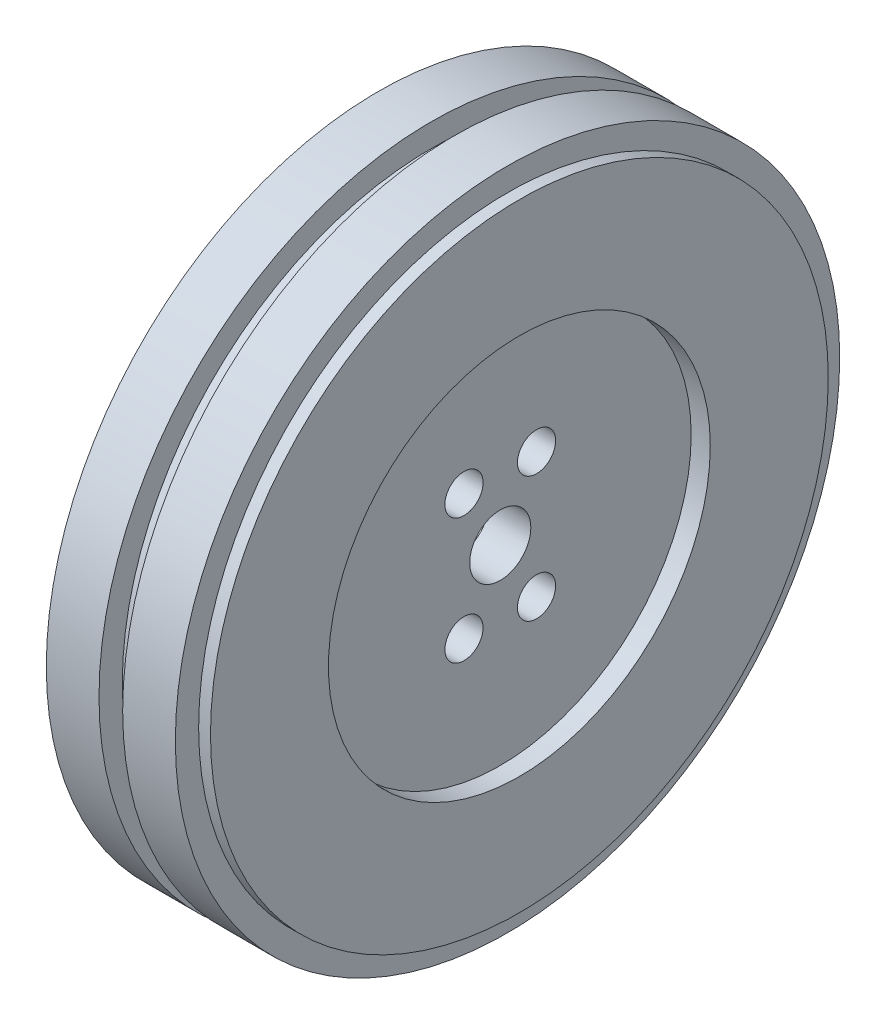
ISO-10303-21;
HEADER;
FILE_DESCRIPTION(('STEP AP214'),'2;1');
FILE_NAME('part.step','',(''),(''),'','','');
FILE_SCHEMA(('AUTOMOTIVE_DESIGN { 1 0 10303 214 1 1 1 1 }'));
ENDSEC;
DATA;
#1=APPLICATION_CONTEXT('core data for automotive mechanical design processes');
#2=APPLICATION_PROTOCOL_DEFINITION('international standard','automotive_design',2000,#1);
#3=PRODUCT_CONTEXT('',#1,'mechanical');
#4=PRODUCT('Part','Part','',(#3));
#5=PRODUCT_RELATED_PRODUCT_CATEGORY('part','',(#4));
#6=PRODUCT_DEFINITION_FORMATION('','',#4);
#7=PRODUCT_DEFINITION_CONTEXT('part definition',#1,'design');
#8=PRODUCT_DEFINITION('design','',#6,#7);
#9=PRODUCT_DEFINITION_SHAPE('','',#8);
#10=(LENGTH_UNIT() NAMED_UNIT(*) SI_UNIT(.MILLI.,.METRE.));
#11=(NAMED_UNIT(*) PLANE_ANGLE_UNIT() SI_UNIT($,.RADIAN.));
#12=(NAMED_UNIT(*) SI_UNIT($,.STERADIAN.) SOLID_ANGLE_UNIT());
#13=UNCERTAINTY_MEASURE_WITH_UNIT(LENGTH_MEASURE(1.E-05),#10,'distance_accuracy_value','');
#14=(GEOMETRIC_REPRESENTATION_CONTEXT(3) GLOBAL_UNCERTAINTY_ASSIGNED_CONTEXT((#13)) GLOBAL_UNIT_ASSIGNED_CONTEXT((#10,
#11,#12)) REPRESENTATION_CONTEXT('',''));
#15=CARTESIAN_POINT('',(0.,0.,0.));
#16=DIRECTION('',(0.,0.,1.));
#17=DIRECTION('',(1.,0.,0.));
#18=AXIS2_PLACEMENT_3D('',#15,#16,#17);
#19=CARTESIAN_POINT('',(8.00000000000001,0.,0.));
#20=DIRECTION('',(-1.,0.,0.));
#21=DIRECTION('',(0.,0.,1.));
#22=AXIS2_PLACEMENT_3D('',#19,#20,#21);
#23=CYLINDRICAL_SURFACE('',#22,43.5);
#24=CARTESIAN_POINT('',(-0.449999999999995,0.,0.));
#25=DIRECTION('',(-1.,0.,0.));
#26=DIRECTION('',(0.,0.,1.));
#27=AXIS2_PLACEMENT_3D('',#24,#25,#26);
#28=CIRCLE('',#27,43.5);
#29=CARTESIAN_POINT('',(-0.449999999999995,0.,43.5));
#30=VERTEX_POINT('',#29);
#31=EDGE_CURVE('E116',#30,#30,#28,.T.);
#32=ORIENTED_EDGE('',*,*,#31,.F.);
#33=EDGE_LOOP('',(#32));
#34=FACE_BOUND('',#33,.T.);
#35=CARTESIAN_POINT('',(6.45,0.,0.));
#36=DIRECTION('',(1.,0.,0.));
#37=DIRECTION('',(0.,0.,-1.));
#38=AXIS2_PLACEMENT_3D('',#35,#36,#37);
#39=CIRCLE('',#38,43.5);
#40=CARTESIAN_POINT('',(6.45,0.,-43.5));
#41=VERTEX_POINT('',#40);
#42=EDGE_CURVE('E105',#41,#41,#39,.T.);
#43=ORIENTED_EDGE('',*,*,#42,.F.);
#44=EDGE_LOOP('',(#43));
#45=FACE_BOUND('',#44,.T.);
#46=ADVANCED_FACE('F37',(#34,#45),#23,.T.);
#47=CARTESIAN_POINT('',(8.,40.,0.));
#48=DIRECTION('',(-1.,0.,0.));
#49=DIRECTION('',(0.,0.,1.));
#50=AXIS2_PLACEMENT_3D('',#47,#48,#49);
#51=PLANE('',#50);
#52=CARTESIAN_POINT('',(8.,0.,0.));
#53=DIRECTION('',(1.,0.,0.));
#54=DIRECTION('',(0.,0.,-1.));
#55=AXIS2_PLACEMENT_3D('',#52,#53,#54);
#56=CIRCLE('',#55,25.);
#57=CARTESIAN_POINT('',(8.,0.,-25.));
#58=VERTEX_POINT('',#57);
#59=EDGE_CURVE('E96',#58,#58,#56,.T.);
#60=ORIENTED_EDGE('',*,*,#59,.F.);
#61=EDGE_LOOP('',(#60));
#62=FACE_BOUND('',#61,.T.);
#63=CARTESIAN_POINT('',(8.,0.,0.));
#64=DIRECTION('',(1.,0.,0.));
#65=DIRECTION('',(0.,0.,-1.));
#66=AXIS2_PLACEMENT_3D('',#63,#64,#65);
#67=CIRCLE('',#66,40.45);
#68=CARTESIAN_POINT('',(8.,0.,-40.45));
#69=VERTEX_POINT('',#68);
#70=EDGE_CURVE('E99',#69,#69,#67,.T.);
#71=ORIENTED_EDGE('',*,*,#70,.T.);
#72=EDGE_LOOP('',(#71));
#73=FACE_BOUND('',#72,.T.);
#74=ADVANCED_FACE('F82',(#62,#73),#51,.F.);
#75=CARTESIAN_POINT('',(-12.,0.,0.));
#76=DIRECTION('',(-1.,0.,0.));
#77=DIRECTION('',(0.,0.,1.));
#78=AXIS2_PLACEMENT_3D('',#75,#76,#77);
#79=PLANE('',#78);
#80=CARTESIAN_POINT('',(-12.,0.,34.));
#81=CARTESIAN_POINT('',(-12.,4.45058959136558,34.));
#82=CARTESIAN_POINT('',(-12.0000000000056,8.89942806935066,33.1150710062384));
#83=CARTESIAN_POINT('',(-11.9999999999944,17.1230453314754,29.7087372045291));
#84=CARTESIAN_POINT('',(-12.,20.8945884800248,27.1886726406605));
#85=CARTESIAN_POINT('',(-12.,27.1886726406605,20.8945884800248));
#86=CARTESIAN_POINT('',(-12.0000000000028,29.7087372045134,17.1230453314644));
#87=CARTESIAN_POINT('',(-11.9999999999972,33.1150710062542,8.89942806936169));
#88=CARTESIAN_POINT('',(-12.,34.,4.4505895913458));
#89=CARTESIAN_POINT('',(-12.,34.,-4.45058959134579));
#90=CARTESIAN_POINT('',(-12.0000000000028,33.1150710062541,-8.89942806935339));
#91=CARTESIAN_POINT('',(-11.9999999999972,29.7087372045134,-17.1230453314727));
#92=CARTESIAN_POINT('',(-12.,27.1886726406575,-20.8945884800278));
#93=CARTESIAN_POINT('',(-12.,20.8945884800277,-27.1886726406575));
#94=CARTESIAN_POINT('',(-12.,17.1230453314671,-29.7087372045226));
#95=CARTESIAN_POINT('',(-12.,8.8994280693591,-33.1150710062449));
#96=CARTESIAN_POINT('',(-12.,4.4505895913458,-34.));
#97=CARTESIAN_POINT('',(-12.,-4.45058959134579,-34.));
#98=CARTESIAN_POINT('',(-12.,-8.89942806935901,-33.1150710062449));
#99=CARTESIAN_POINT('',(-12.,-17.123045331467,-29.7087372045226));
#100=CARTESIAN_POINT('',(-12.,-20.8945884800278,-27.1886726406519));
#101=CARTESIAN_POINT('',(-12.,-27.1886726406575,-20.8945884800333));
#102=CARTESIAN_POINT('',(-11.9999999999972,-29.7087372045226,-17.1230453314643));
#103=CARTESIAN_POINT('',(-12.0000000000028,-33.1150710062449,-8.89942806936187));
#104=CARTESIAN_POINT('',(-12.,-34.,-4.45058959134575));
#105=CARTESIAN_POINT('',(-12.,-34.,4.45058959134585));
#106=CARTESIAN_POINT('',(-12.,-33.1150710062449,8.899428069359));
#107=CARTESIAN_POINT('',(-12.,-29.7087372045226,17.123045331467));
#108=CARTESIAN_POINT('',(-11.9999999999972,-27.1886726406575,20.8945884800221));
#109=CARTESIAN_POINT('',(-12.0000000000028,-20.8945884800278,27.188672640663));
#110=CARTESIAN_POINT('',(-12.0000000000028,-17.1230453314671,29.7087372045115));
#111=CARTESIAN_POINT('',(-11.9999999999972,-8.89942806935909,33.115071006256));
#112=CARTESIAN_POINT('',(-12.,-4.45058959136559,34.));
#113=CARTESIAN_POINT('',(-12.,0.,34.));
#114=(BOUNDED_CURVE() B_SPLINE_CURVE(3,(#80,#81,#82,#83,#84,#85,#86,#87,#88,#89,#90,#91,#92,#93,
#94,#95,#96,#97,#98,#99,#100,#101,#102,#103,#104,#105,#106,#107,#108,#109,#110,#111,#112,#113),
.UNSPECIFIED.,.T.,.F.) B_SPLINE_CURVE_WITH_KNOTS((4,2,2,2,2,2,2,2,2,2,2,2,2,2,2,2,4),(0.,
0.392699081698724,0.785398163397448,1.17809724509617,1.5707963267949,1.96349540849362,
2.35619449019234,2.74889357189107,3.14159265358979,3.53429173528852,3.92699081698724,
4.31968989868597,4.71238898038469,5.10508806208341,5.49778714378214,5.89048622548086,
6.28318530717959),
.UNSPECIFIED.) CURVE() GEOMETRIC_REPRESENTATION_ITEM() RATIONAL_B_SPLINE_CURVE((1.,1.,1.,1.,1.,
1.,1.,1.,1.,1.,1.,1.,1.,1.,1.,1.,1.,1.,1.,1.,1.,1.,1.,1.,1.,1.,1.,1.,1.,1.,1.,1.,1.,1.)) REPRESENTATION_ITEM(''));
#115=CARTESIAN_POINT('',(-12.,0.,34.));
#116=VERTEX_POINT('',#115);
#117=EDGE_CURVE('E137',#116,#116,#114,.F.);
#118=ORIENTED_EDGE('',*,*,#117,.T.);
#119=EDGE_LOOP('',(#118));
#120=FACE_BOUND('',#119,.T.);
#121=CARTESIAN_POINT('',(-12.,0.,0.));
#122=DIRECTION('',(-1.,0.,0.));
#123=DIRECTION('',(0.,0.,1.));
#124=AXIS2_PLACEMENT_3D('',#121,#122,#123);
#125=CIRCLE('',#124,40.45);
#126=CARTESIAN_POINT('',(-12.,0.,40.45));
#127=VERTEX_POINT('',#126);
#128=EDGE_CURVE('E125',#127,#127,#125,.T.);
#129=ORIENTED_EDGE('',*,*,#128,.T.);
#130=EDGE_LOOP('',(#129));
#131=FACE_BOUND('',#130,.T.);
#132=ADVANCED_FACE('F84',(#120,#131),#79,.T.);
#133=CARTESIAN_POINT('',(-3.54999999999999,0.,0.));
#134=DIRECTION('',(-1.,0.,0.));
#135=DIRECTION('',(0.,0.,1.));
#136=AXIS2_PLACEMENT_3D('',#133,#134,#135);
#137=CIRCLE('',#136,43.5);
#138=CARTESIAN_POINT('',(-3.54999999999999,0.,43.5));
#139=VERTEX_POINT('',#138);
#140=EDGE_CURVE('E122',#139,#139,#137,.T.);
#141=ORIENTED_EDGE('',*,*,#140,.T.);
#142=EDGE_LOOP('',(#141));
#143=FACE_BOUND('',#142,.T.);
#144=CARTESIAN_POINT('',(-10.45,0.,0.));
#145=DIRECTION('',(-1.,0.,0.));
#146=DIRECTION('',(0.,0.,1.));
#147=AXIS2_PLACEMENT_3D('',#144,#145,#146);
#148=CIRCLE('',#147,43.5);
#149=CARTESIAN_POINT('',(-10.45,0.,43.5));
#150=VERTEX_POINT('',#149);
#151=EDGE_CURVE('E129',#150,#150,#148,.T.);
#152=ORIENTED_EDGE('',*,*,#151,.F.);
#153=EDGE_LOOP('',(#152));
#154=FACE_BOUND('',#153,.T.);
#155=ADVANCED_FACE('F80',(#143,#154),#23,.T.);
#156=CARTESIAN_POINT('',(0.,34.,0.));
#157=DIRECTION('',(1.,0.,0.));
#158=DIRECTION('',(0.,0.,-1.));
#159=AXIS2_PLACEMENT_3D('',#156,#157,#158);
#160=PLANE('',#159);
#161=CARTESIAN_POINT('',(0.,0.,24.4606079858305));
#162=CARTESIAN_POINT('',(0.,-3.20188609706504,24.4606079858305));
#163=CARTESIAN_POINT('',(0.,-6.40251239125347,23.8239638325556));
#164=CARTESIAN_POINT('',(0.,-12.3188264522557,21.3733463092263));
#165=CARTESIAN_POINT('',(0.,-15.0321864069167,19.5603371505365));
#166=CARTESIAN_POINT('',(0.,-19.5603371505366,15.0321864069166));
#167=CARTESIAN_POINT('',(0.,-21.3733463092319,12.3188264522529));
#168=CARTESIAN_POINT('',(0.,-23.8239638325501,6.40251239125618));
#169=CARTESIAN_POINT('',(0.,-24.4606079858361,3.20188609705085));
#170=CARTESIAN_POINT('',(0.,-24.460607985825,-3.20188609705077));
#171=CARTESIAN_POINT('',(0.,-23.8239638325445,-6.40251239125624));
#172=CARTESIAN_POINT('',(0.,-21.3733463092374,-12.3188264522529));
#173=CARTESIAN_POINT('',(0.,-19.5603371505366,-15.0321864069222));
#174=CARTESIAN_POINT('',(0.,-15.0321864069166,-19.560337150531));
#175=CARTESIAN_POINT('',(0.,-12.3188264522529,-21.3733463092374));
#176=CARTESIAN_POINT('',(0.,-6.40251239125618,-23.8239638325445));
#177=CARTESIAN_POINT('',(0.,-3.2018860970508,-24.4606079858305));
#178=CARTESIAN_POINT('',(0.,3.20188609705081,-24.4606079858305));
#179=CARTESIAN_POINT('',(0.,6.40251239125347,-23.8239638325445));
#180=CARTESIAN_POINT('',(0.,12.3188264522557,-21.3733463092374));
#181=CARTESIAN_POINT('',(0.,15.0321864069166,-19.5603371505366));
#182=CARTESIAN_POINT('',(0.,19.5603371505365,-15.0321864069166));
#183=CARTESIAN_POINT('',(0.,21.3733463092197,-12.3188264522551));
#184=CARTESIAN_POINT('',(0.,23.8239638325623,-6.40251239125404));
#185=CARTESIAN_POINT('',(0.,24.4606079858305,-3.2018860970508));
#186=CARTESIAN_POINT('',(0.,24.4606079858305,3.2018860970508));
#187=CARTESIAN_POINT('',(0.,23.8239638325567,6.40251239125958));
#188=CARTESIAN_POINT('',(0.,21.3733463092252,12.3188264522495));
#189=CARTESIAN_POINT('',(0.,19.5603371505371,15.0321864069105));
#190=CARTESIAN_POINT('',(0.,15.032186406916,19.5603371505427));
#191=CARTESIAN_POINT('',(0.,12.3188264522609,21.3733463092397));
#192=CARTESIAN_POINT('',(0.,6.40251239124819,23.8239638325423));
#193=CARTESIAN_POINT('',(0.,3.20188609706504,24.4606079858305));
#194=CARTESIAN_POINT('',(0.,0.,24.4606079858305));
#195=(BOUNDED_CURVE() B_SPLINE_CURVE(3,(#161,#162,#163,#164,#165,#166,#167,#168,#169,#170,#171,
#172,#173,#174,#175,#176,#177,#178,#179,#180,#181,#182,#183,#184,#185,#186,#187,#188,#189,#190,
#191,#192,#193,#194),.UNSPECIFIED.,.T.,.F.) B_SPLINE_CURVE_WITH_KNOTS((4,2,2,2,2,2,2,2,2,2,2,2,
2,2,2,2,4),(0.,0.392699081698725,0.785398163397448,1.17809724509617,1.5707963267949,
1.96349540849362,2.35619449019234,2.74889357189107,3.14159265358979,3.53429173528852,
3.92699081698724,4.31968989868597,4.71238898038469,5.10508806208341,5.49778714378214,
5.89048622548086,6.28318530717959),
.UNSPECIFIED.) CURVE() GEOMETRIC_REPRESENTATION_ITEM() RATIONAL_B_SPLINE_CURVE((1.,1.,1.,1.,1.,
1.,1.,1.,1.,1.,1.,1.,1.,1.,1.,1.,1.,1.,1.,1.,1.,1.,1.,1.,1.,1.,1.,1.,1.,1.,1.,1.,1.,1.)) REPRESENTATION_ITEM(''));
#196=CARTESIAN_POINT('',(0.,0.,24.4606079858305));
#197=VERTEX_POINT('',#196);
#198=EDGE_CURVE('E11',#197,#197,#195,.F.);
#199=ORIENTED_EDGE('',*,*,#198,.T.);
#200=EDGE_LOOP('',(#199));
#201=FACE_BOUND('',#200,.T.);
#202=CARTESIAN_POINT('',(0.,0.,0.));
#203=DIRECTION('',(1.,0.,0.));
#204=DIRECTION('',(0.,0.,-1.));
#205=AXIS2_PLACEMENT_3D('',#202,#203,#204);
#206=CIRCLE('',#205,4.);
#207=CARTESIAN_POINT('',(0.,0.,-4.));
#208=VERTEX_POINT('',#207);
#209=EDGE_CURVE('E139',#208,#208,#206,.T.);
#210=ORIENTED_EDGE('',*,*,#209,.T.);
#211=EDGE_LOOP('',(#210));
#212=FACE_BOUND('',#211,.T.);
#213=CARTESIAN_POINT('',(0.,8.22724133595216,4.75000000000001));
#214=DIRECTION('',(1.,0.,0.));
#215=DIRECTION('',(0.,0.,-1.));
#216=AXIS2_PLACEMENT_3D('',#213,#214,#215);
#217=CIRCLE('',#216,2.5);
#218=CARTESIAN_POINT('',(0.,8.22724133595216,2.25000000000001));
#219=VERTEX_POINT('',#218);
#220=EDGE_CURVE('E51',#219,#219,#217,.T.);
#221=ORIENTED_EDGE('',*,*,#220,.T.);
#222=EDGE_LOOP('',(#221));
#223=FACE_BOUND('',#222,.T.);
#224=CARTESIAN_POINT('',(0.,-8.22724133595216,-4.75000000000001));
#225=DIRECTION('',(1.,0.,0.));
#226=DIRECTION('',(0.,0.,-1.));
#227=AXIS2_PLACEMENT_3D('',#224,#225,#226);
#228=CIRCLE('',#227,2.5);
#229=CARTESIAN_POINT('',(0.,-8.22724133595216,-7.25000000000001));
#230=VERTEX_POINT('',#229);
#231=EDGE_CURVE('E56',#230,#230,#228,.T.);
#232=ORIENTED_EDGE('',*,*,#231,.T.);
#233=EDGE_LOOP('',(#232));
#234=FACE_BOUND('',#233,.T.);
#235=CARTESIAN_POINT('',(0.,-8.22724133595216,4.75000000000001));
#236=DIRECTION('',(1.,0.,0.));
#237=DIRECTION('',(0.,0.,-1.));
#238=AXIS2_PLACEMENT_3D('',#235,#236,#237);
#239=CIRCLE('',#238,2.5);
#240=CARTESIAN_POINT('',(0.,-8.22724133595216,2.25000000000001));
#241=VERTEX_POINT('',#240);
#242=EDGE_CURVE('E61',#241,#241,#239,.T.);
#243=ORIENTED_EDGE('',*,*,#242,.T.);
#244=EDGE_LOOP('',(#243));
#245=FACE_BOUND('',#244,.T.);
#246=CARTESIAN_POINT('',(0.,8.22724133595216,-4.75000000000001));
#247=DIRECTION('',(1.,0.,0.));
#248=DIRECTION('',(0.,0.,-1.));
#249=AXIS2_PLACEMENT_3D('',#246,#247,#248);
#250=CIRCLE('',#249,2.5);
#251=CARTESIAN_POINT('',(0.,8.22724133595216,-7.25000000000001));
#252=VERTEX_POINT('',#251);
#253=EDGE_CURVE('E142',#252,#252,#250,.T.);
#254=ORIENTED_EDGE('',*,*,#253,.T.);
#255=EDGE_LOOP('',(#254));
#256=FACE_BOUND('',#255,.T.);
#257=ADVANCED_FACE('F70',(#201,#212,#223,#234,#245,#256),#160,.F.);
#258=CARTESIAN_POINT('',(-32.,8.22724133595216,-4.75000000000001));
#259=DIRECTION('',(1.,0.,0.));
#260=DIRECTION('',(0.,0.,-1.));
#261=AXIS2_PLACEMENT_3D('',#258,#259,#260);
#262=CYLINDRICAL_SURFACE('',#261,2.5);
#263=ORIENTED_EDGE('',*,*,#253,.F.);
#264=EDGE_LOOP('',(#263));
#265=FACE_BOUND('',#264,.T.);
#266=CARTESIAN_POINT('',(5.5,8.22724133595216,-4.75000000000001));
#267=DIRECTION('',(1.,0.,0.));
#268=DIRECTION('',(0.,0.,-1.));
#269=AXIS2_PLACEMENT_3D('',#266,#267,#268);
#270=CIRCLE('',#269,2.5);
#271=CARTESIAN_POINT('',(5.5,8.22724133595216,-7.25000000000001));
#272=VERTEX_POINT('',#271);
#273=EDGE_CURVE('E161',#272,#272,#270,.T.);
#274=ORIENTED_EDGE('',*,*,#273,.T.);
#275=EDGE_LOOP('',(#274));
#276=FACE_BOUND('',#275,.T.);
#277=ADVANCED_FACE('F79',(#265,#276),#262,.F.);
#278=CARTESIAN_POINT('',(-32.,-8.22724133595216,4.75000000000001));
#279=DIRECTION('',(1.,0.,0.));
#280=DIRECTION('',(0.,0.,-1.));
#281=AXIS2_PLACEMENT_3D('',#278,#279,#280);
#282=CYLINDRICAL_SURFACE('',#281,2.5);
#283=ORIENTED_EDGE('',*,*,#242,.F.);
#284=EDGE_LOOP('',(#283));
#285=FACE_BOUND('',#284,.T.);
#286=CARTESIAN_POINT('',(5.5,-8.22724133595216,4.75000000000001));
#287=DIRECTION('',(1.,0.,0.));
#288=DIRECTION('',(0.,0.,-1.));
#289=AXIS2_PLACEMENT_3D('',#286,#287,#288);
#290=CIRCLE('',#289,2.5);
#291=CARTESIAN_POINT('',(5.5,-8.22724133595216,2.25000000000001));
#292=VERTEX_POINT('',#291);
#293=EDGE_CURVE('E156',#292,#292,#290,.T.);
#294=ORIENTED_EDGE('',*,*,#293,.T.);
#295=EDGE_LOOP('',(#294));
#296=FACE_BOUND('',#295,.T.);
#297=ADVANCED_FACE('F149',(#285,#296),#282,.F.);
#298=CARTESIAN_POINT('',(-32.,-8.22724133595216,-4.75000000000001));
#299=DIRECTION('',(1.,0.,0.));
#300=DIRECTION('',(0.,0.,-1.));
#301=AXIS2_PLACEMENT_3D('',#298,#299,#300);
#302=CYLINDRICAL_SURFACE('',#301,2.5);
#303=ORIENTED_EDGE('',*,*,#231,.F.);
#304=EDGE_LOOP('',(#303));
#305=FACE_BOUND('',#304,.T.);
#306=CARTESIAN_POINT('',(5.5,-8.22724133595216,-4.75000000000001));
#307=DIRECTION('',(1.,0.,0.));
#308=DIRECTION('',(0.,0.,-1.));
#309=AXIS2_PLACEMENT_3D('',#306,#307,#308);
#310=CIRCLE('',#309,2.5);
#311=CARTESIAN_POINT('',(5.5,-8.22724133595216,-7.25000000000001));
#312=VERTEX_POINT('',#311);
#313=EDGE_CURVE('E158',#312,#312,#310,.T.);
#314=ORIENTED_EDGE('',*,*,#313,.T.);
#315=EDGE_LOOP('',(#314));
#316=FACE_BOUND('',#315,.T.);
#317=ADVANCED_FACE('F152',(#305,#316),#302,.F.);
#318=CARTESIAN_POINT('',(-32.,8.22724133595216,4.75000000000001));
#319=DIRECTION('',(1.,0.,0.));
#320=DIRECTION('',(0.,0.,-1.));
#321=AXIS2_PLACEMENT_3D('',#318,#319,#320);
#322=CYLINDRICAL_SURFACE('',#321,2.5);
#323=ORIENTED_EDGE('',*,*,#220,.F.);
#324=EDGE_LOOP('',(#323));
#325=FACE_BOUND('',#324,.T.);
#326=CARTESIAN_POINT('',(5.5,8.22724133595216,4.75000000000001));
#327=DIRECTION('',(1.,0.,0.));
#328=DIRECTION('',(0.,0.,-1.));
#329=AXIS2_PLACEMENT_3D('',#326,#327,#328);
#330=CIRCLE('',#329,2.5);
#331=CARTESIAN_POINT('',(5.5,8.22724133595216,2.25000000000001));
#332=VERTEX_POINT('',#331);
#333=EDGE_CURVE('E108',#332,#332,#330,.T.);
#334=ORIENTED_EDGE('',*,*,#333,.T.);
#335=EDGE_LOOP('',(#334));
#336=FACE_BOUND('',#335,.T.);
#337=ADVANCED_FACE('F169',(#325,#336),#322,.F.);
#338=CARTESIAN_POINT('',(-32.,0.,0.));
#339=DIRECTION('',(1.,0.,0.));
#340=DIRECTION('',(0.,0.,-1.));
#341=AXIS2_PLACEMENT_3D('',#338,#339,#340);
#342=CYLINDRICAL_SURFACE('',#341,4.);
#343=ORIENTED_EDGE('',*,*,#209,.F.);
#344=EDGE_LOOP('',(#343));
#345=FACE_BOUND('',#344,.T.);
#346=CARTESIAN_POINT('',(5.5,0.,0.));
#347=DIRECTION('',(1.,0.,0.));
#348=DIRECTION('',(0.,0.,-1.));
#349=AXIS2_PLACEMENT_3D('',#346,#347,#348);
#350=CIRCLE('',#349,4.);
#351=CARTESIAN_POINT('',(5.5,0.,-4.));
#352=VERTEX_POINT('',#351);
#353=EDGE_CURVE('E102',#352,#352,#350,.T.);
#354=ORIENTED_EDGE('',*,*,#353,.T.);
#355=EDGE_LOOP('',(#354));
#356=FACE_BOUND('',#355,.T.);
#357=ADVANCED_FACE('F207',(#345,#356),#342,.F.);
#358=CARTESIAN_POINT('',(5.5,0.,0.));
#359=DIRECTION('',(1.,0.,0.));
#360=DIRECTION('',(0.,0.,-1.));
#361=AXIS2_PLACEMENT_3D('',#358,#359,#360);
#362=CYLINDRICAL_SURFACE('',#361,25.);
#363=CARTESIAN_POINT('',(5.5,0.,0.));
#364=DIRECTION('',(1.,0.,0.));
#365=DIRECTION('',(0.,0.,-1.));
#366=AXIS2_PLACEMENT_3D('',#363,#364,#365);
#367=CIRCLE('',#366,25.);
#368=CARTESIAN_POINT('',(5.5,0.,-25.));
#369=VERTEX_POINT('',#368);
#370=EDGE_CURVE('E134',#369,#369,#367,.T.);
#371=ORIENTED_EDGE('',*,*,#370,.F.);
#372=EDGE_LOOP('',(#371));
#373=FACE_BOUND('',#372,.T.);
#374=ORIENTED_EDGE('',*,*,#59,.T.);
#375=EDGE_LOOP('',(#374));
#376=FACE_BOUND('',#375,.T.);
#377=ADVANCED_FACE('F175',(#373,#376),#362,.F.);
#378=CARTESIAN_POINT('',(5.5,0.,0.));
#379=DIRECTION('',(1.,0.,0.));
#380=DIRECTION('',(0.,0.,-1.));
#381=AXIS2_PLACEMENT_3D('',#378,#379,#380);
#382=PLANE('',#381);
#383=ORIENTED_EDGE('',*,*,#370,.T.);
#384=EDGE_LOOP('',(#383));
#385=FACE_BOUND('',#384,.T.);
#386=ORIENTED_EDGE('',*,*,#313,.F.);
#387=EDGE_LOOP('',(#386));
#388=FACE_BOUND('',#387,.T.);
#389=ORIENTED_EDGE('',*,*,#333,.F.);
#390=EDGE_LOOP('',(#389));
#391=FACE_BOUND('',#390,.T.);
#392=ORIENTED_EDGE('',*,*,#353,.F.);
#393=EDGE_LOOP('',(#392));
#394=FACE_BOUND('',#393,.T.);
#395=ORIENTED_EDGE('',*,*,#273,.F.);
#396=EDGE_LOOP('',(#395));
#397=FACE_BOUND('',#396,.T.);
#398=ORIENTED_EDGE('',*,*,#293,.F.);
#399=EDGE_LOOP('',(#398));
#400=FACE_BOUND('',#399,.T.);
#401=ADVANCED_FACE('F171',(#385,#388,#391,#394,#397,#400),#382,.T.);
#402=CARTESIAN_POINT('',(-10.45,0.,0.));
#403=DIRECTION('',(-1.,0.,0.));
#404=DIRECTION('',(0.,0.,1.));
#405=AXIS2_PLACEMENT_3D('',#402,#403,#404);
#406=PLANE('',#405);
#407=CARTESIAN_POINT('',(-10.45,0.,0.));
#408=DIRECTION('',(-1.,0.,0.));
#409=DIRECTION('',(0.,0.,1.));
#410=AXIS2_PLACEMENT_3D('',#407,#408,#409);
#411=CIRCLE('',#410,40.45);
#412=CARTESIAN_POINT('',(-10.45,0.,40.45));
#413=VERTEX_POINT('',#412);
#414=EDGE_CURVE('E126',#413,#413,#411,.T.);
#415=ORIENTED_EDGE('',*,*,#414,.F.);
#416=EDGE_LOOP('',(#415));
#417=FACE_BOUND('',#416,.T.);
#418=ORIENTED_EDGE('',*,*,#151,.T.);
#419=EDGE_LOOP('',(#418));
#420=FACE_BOUND('',#419,.T.);
#421=ADVANCED_FACE('F174',(#417,#420),#406,.T.);
#422=CARTESIAN_POINT('',(-10.45,0.,0.));
#423=DIRECTION('',(-1.,0.,0.));
#424=DIRECTION('',(0.,0.,1.));
#425=AXIS2_PLACEMENT_3D('',#422,#423,#424);
#426=CYLINDRICAL_SURFACE('',#425,40.45);
#427=CARTESIAN_POINT('',(-10.45,0.,40.45));
#428=CARTESIAN_POINT('',(-10.4661458333333,0.,40.45));
#429=CARTESIAN_POINT('',(-10.4822916666667,0.,40.45));
#430=CARTESIAN_POINT('',(-10.5145833333333,0.,40.45));
#431=CARTESIAN_POINT('',(-10.5307291666667,0.,40.45));
#432=CARTESIAN_POINT('',(-10.5630208333333,0.,40.45));
#433=CARTESIAN_POINT('',(-10.5791666666667,0.,40.45));
#434=CARTESIAN_POINT('',(-10.6114583333333,0.,40.45));
#435=CARTESIAN_POINT('',(-10.6276041666667,0.,40.45));
#436=CARTESIAN_POINT('',(-10.6598958333333,0.,40.45));
#437=CARTESIAN_POINT('',(-10.6760416666667,0.,40.45));
#438=CARTESIAN_POINT('',(-10.7083333333333,0.,40.45));
#439=CARTESIAN_POINT('',(-10.7244791666667,0.,40.45));
#440=CARTESIAN_POINT('',(-10.7567708333333,0.,40.45));
#441=CARTESIAN_POINT('',(-10.7729166666667,0.,40.45));
#442=CARTESIAN_POINT('',(-10.8052083333333,0.,40.45));
#443=CARTESIAN_POINT('',(-10.8213541666667,0.,40.45));
#444=CARTESIAN_POINT('',(-10.8536458333333,0.,40.45));
#445=CARTESIAN_POINT('',(-10.8697916666667,0.,40.45));
#446=CARTESIAN_POINT('',(-10.9020833333333,0.,40.45));
#447=CARTESIAN_POINT('',(-10.9182291666667,0.,40.45));
#448=CARTESIAN_POINT('',(-10.9505208333333,0.,40.45));
#449=CARTESIAN_POINT('',(-10.9666666666667,0.,40.45));
#450=CARTESIAN_POINT('',(-10.9989583333333,0.,40.45));
#451=CARTESIAN_POINT('',(-11.0151041666667,0.,40.45));
#452=CARTESIAN_POINT('',(-11.0473958333333,0.,40.45));
#453=CARTESIAN_POINT('',(-11.0635416666667,0.,40.45));
#454=CARTESIAN_POINT('',(-11.0958333333333,0.,40.45));
#455=CARTESIAN_POINT('',(-11.1119791666667,0.,40.45));
#456=CARTESIAN_POINT('',(-11.1442708333333,0.,40.45));
#457=CARTESIAN_POINT('',(-11.1604166666667,0.,40.45));
#458=CARTESIAN_POINT('',(-11.1927083333333,0.,40.45));
#459=CARTESIAN_POINT('',(-11.2088541666667,0.,40.45));
#460=CARTESIAN_POINT('',(-11.2411458333333,0.,40.45));
#461=CARTESIAN_POINT('',(-11.2572916666667,0.,40.45));
#462=CARTESIAN_POINT('',(-11.2895833333333,0.,40.45));
#463=CARTESIAN_POINT('',(-11.3057291666667,0.,40.45));
#464=CARTESIAN_POINT('',(-11.3380208333333,0.,40.45));
#465=CARTESIAN_POINT('',(-11.3541666666667,0.,40.45));
#466=CARTESIAN_POINT('',(-11.3864583333333,0.,40.45));
#467=CARTESIAN_POINT('',(-11.4026041666667,0.,40.45));
#468=CARTESIAN_POINT('',(-11.4348958333333,0.,40.45));
#469=CARTESIAN_POINT('',(-11.4510416666667,0.,40.45));
#470=CARTESIAN_POINT('',(-11.4833333333333,0.,40.45));
#471=CARTESIAN_POINT('',(-11.4994791666667,0.,40.45));
#472=CARTESIAN_POINT('',(-11.5317708333333,0.,40.45));
#473=CARTESIAN_POINT('',(-11.5479166666667,0.,40.45));
#474=CARTESIAN_POINT('',(-11.5802083333333,0.,40.45));
#475=CARTESIAN_POINT('',(-11.5963541666667,0.,40.45));
#476=CARTESIAN_POINT('',(-11.6286458333333,0.,40.45));
#477=CARTESIAN_POINT('',(-11.6447916666667,0.,40.45));
#478=CARTESIAN_POINT('',(-11.6770833333333,0.,40.45));
#479=CARTESIAN_POINT('',(-11.6932291666667,0.,40.45));
#480=CARTESIAN_POINT('',(-11.7255208333333,0.,40.45));
#481=CARTESIAN_POINT('',(-11.7416666666667,0.,40.45));
#482=CARTESIAN_POINT('',(-11.7739583333333,0.,40.45));
#483=CARTESIAN_POINT('',(-11.7901041666667,0.,40.45));
#484=CARTESIAN_POINT('',(-11.8223958333333,0.,40.45));
#485=CARTESIAN_POINT('',(-11.8385416666667,0.,40.45));
#486=CARTESIAN_POINT('',(-11.8708333333333,0.,40.45));
#487=CARTESIAN_POINT('',(-11.8869791666667,0.,40.45));
#488=CARTESIAN_POINT('',(-11.9192708333333,0.,40.45));
#489=CARTESIAN_POINT('',(-11.9354166666667,0.,40.45));
#490=CARTESIAN_POINT('',(-11.9677083333333,0.,40.45));
#491=CARTESIAN_POINT('',(-11.9838541666667,0.,40.45));
#492=CARTESIAN_POINT('',(-12.,0.,40.45));
#493=B_SPLINE_CURVE_WITH_KNOTS('',3,(#427,#428,#429,#430,#431,#432,#433,#434,#435,#436,#437,
#438,#439,#440,#441,#442,#443,#444,#445,#446,#447,#448,#449,#450,#451,#452,#453,#454,#455,#456,
#457,#458,#459,#460,#461,#462,#463,#464,#465,#466,#467,#468,#469,#470,#471,#472,#473,#474,#475,
#476,#477,#478,#479,#480,#481,#482,#483,#484,#485,#486,#487,#488,#489,#490,#491,#492),
.UNSPECIFIED.,.F.,.F.,(4,2,2,2,2,2,2,2,2,2,2,2,2,2,2,2,2,2,2,2,2,2,2,2,2,2,2,2,2,2,2,2,4),(0.,
0.0484375000000016,0.0968750000000015,0.145312500000001,0.193750000000001,0.242187500000001,
0.290625000000001,0.339062500000001,0.387500000000001,0.435937500000001,0.484375,0.5328125,
0.58125,0.6296875,0.678125,0.7265625,0.775,0.823437500000001,0.871875000000001,
0.920312500000001,0.968750000000001,1.0171875,1.065625,1.1140625,1.1625,1.2109375,1.259375,
1.3078125,1.35625,1.4046875,1.453125,1.5015625,1.55),.UNSPECIFIED.);
#494=EDGE_CURVE('BSEAM234',#413,#127,#493,.T.);
#495=ORIENTED_EDGE('',*,*,#414,.T.);
#496=ORIENTED_EDGE('',*,*,#128,.F.);
#497=ORIENTED_EDGE('',*,*,#494,.T.);
#498=ORIENTED_EDGE('',*,*,#494,.F.);
#499=EDGE_LOOP('',(#495,#497,#496,#498));
#500=FACE_BOUND('',#499,.T.);
#501=ADVANCED_FACE('F234',(#500),#426,.T.);
#502=CARTESIAN_POINT('',(-3.54999999999999,0.,0.));
#503=DIRECTION('',(-1.,0.,0.));
#504=DIRECTION('',(0.,0.,1.));
#505=AXIS2_PLACEMENT_3D('',#502,#503,#504);
#506=PLANE('',#505);
#507=ORIENTED_EDGE('',*,*,#140,.F.);
#508=EDGE_LOOP('',(#507));
#509=FACE_BOUND('',#508,.T.);
#510=CARTESIAN_POINT('',(-3.54999999999999,0.,0.));
#511=DIRECTION('',(-1.,0.,0.));
#512=DIRECTION('',(0.,0.,1.));
#513=AXIS2_PLACEMENT_3D('',#510,#511,#512);
#514=CIRCLE('',#513,40.45);
#515=CARTESIAN_POINT('',(-3.54999999999999,0.,-40.45));
#516=VERTEX_POINT('',#515);
#517=EDGE_CURVE('E119',#516,#516,#514,.T.);
#518=ORIENTED_EDGE('',*,*,#517,.T.);
#519=EDGE_LOOP('',(#518));
#520=FACE_BOUND('',#519,.T.);
#521=ADVANCED_FACE('F242',(#509,#520),#506,.F.);
#522=CARTESIAN_POINT('',(-3.54999999999999,0.,0.));
#523=DIRECTION('',(1.,0.,0.));
#524=DIRECTION('',(0.,0.,-1.));
#525=AXIS2_PLACEMENT_3D('',#522,#523,#524);
#526=CYLINDRICAL_SURFACE('',#525,40.45);
#527=CARTESIAN_POINT('',(-0.449999999999995,0.,0.));
#528=DIRECTION('',(-1.,0.,0.));
#529=DIRECTION('',(0.,0.,1.));
#530=AXIS2_PLACEMENT_3D('',#527,#528,#529);
#531=CIRCLE('',#530,40.45);
#532=CARTESIAN_POINT('',(-0.449999999999995,0.,-40.45));
#533=VERTEX_POINT('',#532);
#534=EDGE_CURVE('E113',#533,#533,#531,.T.);
#535=CARTESIAN_POINT('',(-3.54999999999999,0.,-40.45));
#536=CARTESIAN_POINT('',(-3.51770833333333,0.,-40.45));
#537=CARTESIAN_POINT('',(-3.48541666666666,0.,-40.45));
#538=CARTESIAN_POINT('',(-3.42083333333333,0.,-40.45));
#539=CARTESIAN_POINT('',(-3.38854166666666,0.,-40.45));
#540=CARTESIAN_POINT('',(-3.32395833333333,0.,-40.45));
#541=CARTESIAN_POINT('',(-3.29166666666666,0.,-40.45));
#542=CARTESIAN_POINT('',(-3.22708333333333,0.,-40.45));
#543=CARTESIAN_POINT('',(-3.19479166666666,0.,-40.45));
#544=CARTESIAN_POINT('',(-3.13020833333333,0.,-40.45));
#545=CARTESIAN_POINT('',(-3.09791666666666,0.,-40.45));
#546=CARTESIAN_POINT('',(-3.03333333333333,0.,-40.45));
#547=CARTESIAN_POINT('',(-3.00104166666666,0.,-40.45));
#548=CARTESIAN_POINT('',(-2.93645833333333,0.,-40.45));
#549=CARTESIAN_POINT('',(-2.90416666666666,0.,-40.45));
#550=CARTESIAN_POINT('',(-2.83958333333333,0.,-40.45));
#551=CARTESIAN_POINT('',(-2.80729166666666,0.,-40.45));
#552=CARTESIAN_POINT('',(-2.74270833333333,0.,-40.45));
#553=CARTESIAN_POINT('',(-2.71041666666666,0.,-40.45));
#554=CARTESIAN_POINT('',(-2.64583333333333,0.,-40.45));
#555=CARTESIAN_POINT('',(-2.61354166666666,0.,-40.45));
#556=CARTESIAN_POINT('',(-2.54895833333333,0.,-40.45));
#557=CARTESIAN_POINT('',(-2.51666666666666,0.,-40.45));
#558=CARTESIAN_POINT('',(-2.45208333333333,0.,-40.45));
#559=CARTESIAN_POINT('',(-2.41979166666666,0.,-40.45));
#560=CARTESIAN_POINT('',(-2.35520833333333,0.,-40.45));
#561=CARTESIAN_POINT('',(-2.32291666666666,0.,-40.45));
#562=CARTESIAN_POINT('',(-2.25833333333333,0.,-40.45));
#563=CARTESIAN_POINT('',(-2.22604166666666,0.,-40.45));
#564=CARTESIAN_POINT('',(-2.16145833333333,0.,-40.45));
#565=CARTESIAN_POINT('',(-2.12916666666666,0.,-40.45));
#566=CARTESIAN_POINT('',(-2.06458333333333,0.,-40.45));
#567=CARTESIAN_POINT('',(-2.03229166666666,0.,-40.45));
#568=CARTESIAN_POINT('',(-1.96770833333333,0.,-40.45));
#569=CARTESIAN_POINT('',(-1.93541666666666,0.,-40.45));
#570=CARTESIAN_POINT('',(-1.87083333333333,0.,-40.45));
#571=CARTESIAN_POINT('',(-1.83854166666666,0.,-40.45));
#572=CARTESIAN_POINT('',(-1.77395833333333,0.,-40.45));
#573=CARTESIAN_POINT('',(-1.74166666666666,0.,-40.45));
#574=CARTESIAN_POINT('',(-1.67708333333333,0.,-40.45));
#575=CARTESIAN_POINT('',(-1.64479166666666,0.,-40.45));
#576=CARTESIAN_POINT('',(-1.58020833333333,0.,-40.45));
#577=CARTESIAN_POINT('',(-1.54791666666666,0.,-40.45));
#578=CARTESIAN_POINT('',(-1.48333333333333,0.,-40.45));
#579=CARTESIAN_POINT('',(-1.45104166666666,0.,-40.45));
#580=CARTESIAN_POINT('',(-1.38645833333333,0.,-40.45));
#581=CARTESIAN_POINT('',(-1.35416666666666,0.,-40.45));
#582=CARTESIAN_POINT('',(-1.28958333333333,0.,-40.45));
#583=CARTESIAN_POINT('',(-1.25729166666666,0.,-40.45));
#584=CARTESIAN_POINT('',(-1.19270833333333,0.,-40.45));
#585=CARTESIAN_POINT('',(-1.16041666666666,0.,-40.45));
#586=CARTESIAN_POINT('',(-1.09583333333333,0.,-40.45));
#587=CARTESIAN_POINT('',(-1.06354166666666,0.,-40.45));
#588=CARTESIAN_POINT('',(-0.998958333333329,0.,-40.45));
#589=CARTESIAN_POINT('',(-0.966666666666662,0.,-40.45));
#590=CARTESIAN_POINT('',(-0.902083333333328,0.,-40.45));
#591=CARTESIAN_POINT('',(-0.869791666666662,0.,-40.45));
#592=CARTESIAN_POINT('',(-0.805208333333328,0.,-40.45));
#593=CARTESIAN_POINT('',(-0.772916666666662,0.,-40.45));
#594=CARTESIAN_POINT('',(-0.708333333333328,0.,-40.45));
#595=CARTESIAN_POINT('',(-0.676041666666662,0.,-40.45));
#596=CARTESIAN_POINT('',(-0.611458333333328,0.,-40.45));
#597=CARTESIAN_POINT('',(-0.579166666666662,0.,-40.45));
#598=CARTESIAN_POINT('',(-0.514583333333329,0.,-40.45));
#599=CARTESIAN_POINT('',(-0.482291666666662,0.,-40.45));
#600=CARTESIAN_POINT('',(-0.449999999999995,0.,-40.45));
#601=B_SPLINE_CURVE_WITH_KNOTS('',3,(#535,#536,#537,#538,#539,#540,#541,#542,#543,#544,#545,
#546,#547,#548,#549,#550,#551,#552,#553,#554,#555,#556,#557,#558,#559,#560,#561,#562,#563,#564,
#565,#566,#567,#568,#569,#570,#571,#572,#573,#574,#575,#576,#577,#578,#579,#580,#581,#582,#583,
#584,#585,#586,#587,#588,#589,#590,#591,#592,#593,#594,#595,#596,#597,#598,#599,#600),
.UNSPECIFIED.,.F.,.F.,(4,2,2,2,2,2,2,2,2,2,2,2,2,2,2,2,2,2,2,2,2,2,2,2,2,2,2,2,2,2,2,2,4),(0.,
0.0968749999999997,0.19375,0.290625,0.3875,0.484375,0.58125,0.678124999999999,0.775,0.871875,
0.96875,1.065625,1.1625,1.259375,1.35625,1.453125,1.55,1.646875,1.74375,1.840625,1.9375,
2.034375,2.13125,2.228125,2.325,2.421875,2.51875,2.615625,2.7125,2.809375,2.90625,3.003125,3.1),.UNSPECIFIED.);
#602=EDGE_CURVE('BSEAM251',#516,#533,#601,.T.);
#603=ORIENTED_EDGE('',*,*,#517,.F.);
#604=ORIENTED_EDGE('',*,*,#534,.T.);
#605=ORIENTED_EDGE('',*,*,#602,.T.);
#606=ORIENTED_EDGE('',*,*,#602,.F.);
#607=EDGE_LOOP('',(#603,#605,#604,#606));
#608=FACE_BOUND('',#607,.T.);
#609=ADVANCED_FACE('F251',(#608),#526,.T.);
#610=CARTESIAN_POINT('',(-0.449999999999995,0.,0.));
#611=DIRECTION('',(-1.,0.,0.));
#612=DIRECTION('',(0.,0.,1.));
#613=AXIS2_PLACEMENT_3D('',#610,#611,#612);
#614=PLANE('',#613);
#615=ORIENTED_EDGE('',*,*,#534,.F.);
#616=EDGE_LOOP('',(#615));
#617=FACE_BOUND('',#616,.T.);
#618=ORIENTED_EDGE('',*,*,#31,.T.);
#619=EDGE_LOOP('',(#618));
#620=FACE_BOUND('',#619,.T.);
#621=ADVANCED_FACE('F259',(#617,#620),#614,.T.);
#622=CARTESIAN_POINT('',(6.45,0.,0.));
#623=DIRECTION('',(1.,0.,0.));
#624=DIRECTION('',(0.,0.,-1.));
#625=AXIS2_PLACEMENT_3D('',#622,#623,#624);
#626=PLANE('',#625);
#627=CARTESIAN_POINT('',(6.45,0.,0.));
#628=DIRECTION('',(1.,0.,0.));
#629=DIRECTION('',(0.,0.,-1.));
#630=AXIS2_PLACEMENT_3D('',#627,#628,#629);
#631=CIRCLE('',#630,40.45);
#632=CARTESIAN_POINT('',(6.45,0.,-40.45));
#633=VERTEX_POINT('',#632);
#634=EDGE_CURVE('E101',#633,#633,#631,.T.);
#635=ORIENTED_EDGE('',*,*,#634,.F.);
#636=EDGE_LOOP('',(#635));
#637=FACE_BOUND('',#636,.T.);
#638=ORIENTED_EDGE('',*,*,#42,.T.);
#639=EDGE_LOOP('',(#638));
#640=FACE_BOUND('',#639,.T.);
#641=ADVANCED_FACE('F267',(#637,#640),#626,.T.);
#642=CARTESIAN_POINT('',(6.45,0.,0.));
#643=DIRECTION('',(1.,0.,0.));
#644=DIRECTION('',(0.,0.,-1.));
#645=AXIS2_PLACEMENT_3D('',#642,#643,#644);
#646=CYLINDRICAL_SURFACE('',#645,40.45);
#647=CARTESIAN_POINT('',(6.45,0.,-40.45));
#648=CARTESIAN_POINT('',(6.46614583333334,0.,-40.45));
#649=CARTESIAN_POINT('',(6.48229166666667,0.,-40.45));
#650=CARTESIAN_POINT('',(6.51458333333334,0.,-40.45));
#651=CARTESIAN_POINT('',(6.53072916666667,0.,-40.45));
#652=CARTESIAN_POINT('',(6.56302083333334,0.,-40.45));
#653=CARTESIAN_POINT('',(6.57916666666667,0.,-40.45));
#654=CARTESIAN_POINT('',(6.61145833333334,0.,-40.45));
#655=CARTESIAN_POINT('',(6.62760416666667,0.,-40.45));
#656=CARTESIAN_POINT('',(6.65989583333334,0.,-40.45));
#657=CARTESIAN_POINT('',(6.67604166666667,0.,-40.45));
#658=CARTESIAN_POINT('',(6.70833333333334,0.,-40.45));
#659=CARTESIAN_POINT('',(6.72447916666667,0.,-40.45));
#660=CARTESIAN_POINT('',(6.75677083333334,0.,-40.45));
#661=CARTESIAN_POINT('',(6.77291666666667,0.,-40.45));
#662=CARTESIAN_POINT('',(6.80520833333334,0.,-40.45));
#663=CARTESIAN_POINT('',(6.82135416666667,0.,-40.45));
#664=CARTESIAN_POINT('',(6.85364583333334,0.,-40.45));
#665=CARTESIAN_POINT('',(6.86979166666667,0.,-40.45));
#666=CARTESIAN_POINT('',(6.90208333333334,0.,-40.45));
#667=CARTESIAN_POINT('',(6.91822916666667,0.,-40.45));
#668=CARTESIAN_POINT('',(6.95052083333334,0.,-40.45));
#669=CARTESIAN_POINT('',(6.96666666666667,0.,-40.45));
#670=CARTESIAN_POINT('',(6.99895833333334,0.,-40.45));
#671=CARTESIAN_POINT('',(7.01510416666667,0.,-40.45));
#672=CARTESIAN_POINT('',(7.04739583333334,0.,-40.45));
#673=CARTESIAN_POINT('',(7.06354166666667,0.,-40.45));
#674=CARTESIAN_POINT('',(7.09583333333334,0.,-40.45));
#675=CARTESIAN_POINT('',(7.11197916666667,0.,-40.45));
#676=CARTESIAN_POINT('',(7.14427083333334,0.,-40.45));
#677=CARTESIAN_POINT('',(7.16041666666667,0.,-40.45));
#678=CARTESIAN_POINT('',(7.19270833333334,0.,-40.45));
#679=CARTESIAN_POINT('',(7.20885416666667,0.,-40.45));
#680=CARTESIAN_POINT('',(7.24114583333334,0.,-40.45));
#681=CARTESIAN_POINT('',(7.25729166666667,0.,-40.45));
#682=CARTESIAN_POINT('',(7.28958333333334,0.,-40.45));
#683=CARTESIAN_POINT('',(7.30572916666667,0.,-40.45));
#684=CARTESIAN_POINT('',(7.33802083333334,0.,-40.45));
#685=CARTESIAN_POINT('',(7.35416666666667,0.,-40.45));
#686=CARTESIAN_POINT('',(7.38645833333334,0.,-40.45));
#687=CARTESIAN_POINT('',(7.40260416666667,0.,-40.45));
#688=CARTESIAN_POINT('',(7.43489583333334,0.,-40.45));
#689=CARTESIAN_POINT('',(7.45104166666667,0.,-40.45));
#690=CARTESIAN_POINT('',(7.48333333333334,0.,-40.45));
#691=CARTESIAN_POINT('',(7.49947916666667,0.,-40.45));
#692=CARTESIAN_POINT('',(7.53177083333334,0.,-40.45));
#693=CARTESIAN_POINT('',(7.54791666666667,0.,-40.45));
#694=CARTESIAN_POINT('',(7.58020833333334,0.,-40.45));
#695=CARTESIAN_POINT('',(7.59635416666667,0.,-40.45));
#696=CARTESIAN_POINT('',(7.62864583333334,0.,-40.45));
#697=CARTESIAN_POINT('',(7.64479166666667,0.,-40.45));
#698=CARTESIAN_POINT('',(7.67708333333334,0.,-40.45));
#699=CARTESIAN_POINT('',(7.69322916666667,0.,-40.45));
#700=CARTESIAN_POINT('',(7.72552083333334,0.,-40.45));
#701=CARTESIAN_POINT('',(7.74166666666667,0.,-40.45));
#702=CARTESIAN_POINT('',(7.77395833333334,0.,-40.45));
#703=CARTESIAN_POINT('',(7.79010416666667,0.,-40.45));
#704=CARTESIAN_POINT('',(7.82239583333334,0.,-40.45));
#705=CARTESIAN_POINT('',(7.83854166666667,0.,-40.45));
#706=CARTESIAN_POINT('',(7.87083333333334,0.,-40.45));
#707=CARTESIAN_POINT('',(7.88697916666667,0.,-40.45));
#708=CARTESIAN_POINT('',(7.91927083333334,0.,-40.45));
#709=CARTESIAN_POINT('',(7.93541666666667,0.,-40.45));
#710=CARTESIAN_POINT('',(7.96770833333334,0.,-40.45));
#711=CARTESIAN_POINT('',(7.98385416666667,0.,-40.45));
#712=CARTESIAN_POINT('',(8.,0.,-40.45));
#713=B_SPLINE_CURVE_WITH_KNOTS('',3,(#647,#648,#649,#650,#651,#652,#653,#654,#655,#656,#657,
#658,#659,#660,#661,#662,#663,#664,#665,#666,#667,#668,#669,#670,#671,#672,#673,#674,#675,#676,
#677,#678,#679,#680,#681,#682,#683,#684,#685,#686,#687,#688,#689,#690,#691,#692,#693,#694,#695,
#696,#697,#698,#699,#700,#701,#702,#703,#704,#705,#706,#707,#708,#709,#710,#711,#712),
.UNSPECIFIED.,.F.,.F.,(4,2,2,2,2,2,2,2,2,2,2,2,2,2,2,2,2,2,2,2,2,2,2,2,2,2,2,2,2,2,2,2,4),(0.,
0.0484374999999999,0.0968749999999997,0.1453125,0.193749999999999,0.242187499999999,
0.290624999999999,0.339062499999999,0.3875,0.4359375,0.484375,0.532812499999999,
0.581249999999999,0.629687499999999,0.678124999999999,0.726562499999999,0.775,0.823437499999999,
0.871874999999999,0.920312499999999,0.968749999999999,1.0171875,1.065625,1.1140625,1.1625,
1.2109375,1.259375,1.3078125,1.35625,1.4046875,1.453125,1.5015625,1.55),.UNSPECIFIED.);
#714=EDGE_CURVE('BSEAM276',#633,#69,#713,.T.);
#715=ORIENTED_EDGE('',*,*,#634,.T.);
#716=ORIENTED_EDGE('',*,*,#70,.F.);
#717=ORIENTED_EDGE('',*,*,#714,.T.);
#718=ORIENTED_EDGE('',*,*,#714,.F.);
#719=EDGE_LOOP('',(#715,#717,#716,#718));
#720=FACE_BOUND('',#719,.T.);
#721=ADVANCED_FACE('F276',(#720),#646,.T.);
#722=CARTESIAN_POINT('',(0.,0.,24.4606079858305));
#723=CARTESIAN_POINT('',(0.,3.20188609706504,24.4606079858305));
#724=CARTESIAN_POINT('',(0.,6.40251239124819,23.8239638325423));
#725=CARTESIAN_POINT('',(0.,12.3188264522609,21.3733463092397));
#726=CARTESIAN_POINT('',(0.,15.032186406916,19.5603371505427));
#727=CARTESIAN_POINT('',(0.,19.5603371505371,15.0321864069105));
#728=CARTESIAN_POINT('',(0.,21.3733463092252,12.3188264522495));
#729=CARTESIAN_POINT('',(0.,23.8239638325567,6.40251239125958));
#730=CARTESIAN_POINT('',(0.,24.4606079858305,3.2018860970508));
#731=CARTESIAN_POINT('',(0.,24.4606079858305,-3.2018860970508));
#732=CARTESIAN_POINT('',(0.,23.8239638325623,-6.40251239125404));
#733=CARTESIAN_POINT('',(0.,21.3733463092197,-12.3188264522551));
#734=CARTESIAN_POINT('',(0.,19.5603371505365,-15.0321864069166));
#735=CARTESIAN_POINT('',(0.,15.0321864069166,-19.5603371505366));
#736=CARTESIAN_POINT('',(0.,12.3188264522557,-21.3733463092374));
#737=CARTESIAN_POINT('',(0.,6.40251239125347,-23.8239638325445));
#738=CARTESIAN_POINT('',(0.,3.20188609705081,-24.4606079858305));
#739=CARTESIAN_POINT('',(0.,-3.2018860970508,-24.4606079858305));
#740=CARTESIAN_POINT('',(0.,-6.40251239125618,-23.8239638325445));
#741=CARTESIAN_POINT('',(0.,-12.3188264522529,-21.3733463092374));
#742=CARTESIAN_POINT('',(0.,-15.0321864069166,-19.560337150531));
#743=CARTESIAN_POINT('',(0.,-19.5603371505366,-15.0321864069222));
#744=CARTESIAN_POINT('',(0.,-21.3733463092374,-12.3188264522529));
#745=CARTESIAN_POINT('',(0.,-23.8239638325445,-6.40251239125624));
#746=CARTESIAN_POINT('',(0.,-24.460607985825,-3.20188609705077));
#747=CARTESIAN_POINT('',(0.,-24.4606079858361,3.20188609705085));
#748=CARTESIAN_POINT('',(0.,-23.8239638325501,6.40251239125618));
#749=CARTESIAN_POINT('',(0.,-21.3733463092319,12.3188264522529));
#750=CARTESIAN_POINT('',(0.,-19.5603371505366,15.0321864069166));
#751=CARTESIAN_POINT('',(0.,-15.0321864069167,19.5603371505365));
#752=CARTESIAN_POINT('',(0.,-12.3188264522557,21.3733463092263));
#753=CARTESIAN_POINT('',(0.,-6.40251239125347,23.8239638325556));
#754=CARTESIAN_POINT('',(0.,-3.20188609706504,24.4606079858305));
#755=CARTESIAN_POINT('',(0.,0.,24.4606079858305));
#756=CARTESIAN_POINT('',(0.,0.,30.2261745878011));
#757=CARTESIAN_POINT('',(0.,3.95659700021372,30.2261745878011));
#758=CARTESIAN_POINT('',(4.16687443830047E-12,7.91163725164412,29.4394681683016));
#759=CARTESIAN_POINT('',(-4.1647060339555E-12,15.2224752254082,26.4112199272628));
#760=CARTESIAN_POINT('',(1.38989778798298E-12,18.5753964510971,24.1708695896227));
#761=CARTESIAN_POINT('',(-1.38729570276901E-12,24.1708695896282,18.5753964511026));
#762=CARTESIAN_POINT('',(-3.4649866504145E-13,26.4112199272587,15.2224752254015));
#763=CARTESIAN_POINT('',(3.47799707648432E-13,29.4394681683057,7.91163725165085));
#764=CARTESIAN_POINT('',(0.,30.2261745878011,3.95659700019613));
#765=CARTESIAN_POINT('',(0.,30.2261745878011,-3.95659700019613));
#766=CARTESIAN_POINT('',(-3.47799707648432E-13,29.4394681683057,-7.91163725164254));
#767=CARTESIAN_POINT('',(3.4649866504145E-13,26.4112199272587,-15.2224752254098));
#768=CARTESIAN_POINT('',(-2.43069482570488E-12,24.1708695896151,-18.5753964511047));
#769=CARTESIAN_POINT('',(2.4293937830979E-12,18.5753964511102,-24.1708695896206));
#770=CARTESIAN_POINT('',(-3.47366026777553E-13,15.2224752254011,-26.4112199272558));
#771=CARTESIAN_POINT('',(3.46932345908559E-13,7.91163725165131,-29.4394681683086));
#772=CARTESIAN_POINT('',(0.,3.95659700019613,-30.2261745878011));
#773=CARTESIAN_POINT('',(0.,-3.95659700019613,-30.2261745878011));
#774=CARTESIAN_POINT('',(1.73552909128078E-12,-7.91163725165123,-29.4394681683086));
#775=CARTESIAN_POINT('',(-1.73596277214978E-12,-15.222475225401,-26.4112199272558));
#776=CARTESIAN_POINT('',(0.,-18.5753964511047,-24.1708695896095));
#777=CARTESIAN_POINT('',(0.,-24.1708695896206,-18.5753964511158));
#778=CARTESIAN_POINT('',(-3.46715505474062E-13,-26.4112199272614,-15.2224752254011));
#779=CARTESIAN_POINT('',(3.47582867212051E-13,-29.439468168303,-7.91163725165131));
#780=CARTESIAN_POINT('',(-1.38794622406873E-12,-30.2261745878011,-3.95659700019608));
#781=CARTESIAN_POINT('',(1.38924726667572E-12,-30.2261745878011,3.95659700019618));
#782=CARTESIAN_POINT('',(2.08137723501686E-12,-29.4394681683031,7.91163725164567));
#783=CARTESIAN_POINT('',(-2.08441300109981E-12,-26.4112199272614,15.2224752254066));
#784=CARTESIAN_POINT('',(-3.1243426770875E-12,-24.1708695896151,18.5753964510991));
#785=CARTESIAN_POINT('',(3.1243426770875E-12,-18.5753964511103,24.1708695896261));
#786=CARTESIAN_POINT('',(-1.04079703772567E-12,-15.2224752254011,26.4112199272502));
#787=CARTESIAN_POINT('',(1.04209808033266E-12,-7.91163725165131,29.4394681683141));
#788=CARTESIAN_POINT('',(0.,-3.95659700021372,30.2261745878011));
#789=CARTESIAN_POINT('',(0.,0.,30.2261745878011));
#790=CARTESIAN_POINT('',(-12.,0.,34.));
#791=CARTESIAN_POINT('',(-12.,4.45058959136558,34.));
#792=CARTESIAN_POINT('',(-12.0000000000056,8.89942806935066,33.1150710062384));
#793=CARTESIAN_POINT('',(-11.9999999999944,17.1230453314754,29.7087372045291));
#794=CARTESIAN_POINT('',(-12.,20.8945884800248,27.1886726406605));
#795=CARTESIAN_POINT('',(-12.,27.1886726406605,20.8945884800248));
#796=CARTESIAN_POINT('',(-12.0000000000028,29.7087372045134,17.1230453314644));
#797=CARTESIAN_POINT('',(-11.9999999999972,33.1150710062542,8.89942806936169));
#798=CARTESIAN_POINT('',(-12.,34.,4.4505895913458));
#799=CARTESIAN_POINT('',(-12.,34.,-4.45058959134579));
#800=CARTESIAN_POINT('',(-12.0000000000028,33.1150710062541,-8.89942806935339));
#801=CARTESIAN_POINT('',(-11.9999999999972,29.7087372045134,-17.1230453314727));
#802=CARTESIAN_POINT('',(-12.,27.1886726406575,-20.8945884800278));
#803=CARTESIAN_POINT('',(-12.,20.8945884800277,-27.1886726406575));
#804=CARTESIAN_POINT('',(-12.,17.1230453314671,-29.7087372045226));
#805=CARTESIAN_POINT('',(-12.,8.8994280693591,-33.1150710062449));
#806=CARTESIAN_POINT('',(-12.,4.4505895913458,-34.));
#807=CARTESIAN_POINT('',(-12.,-4.45058959134579,-34.));
#808=CARTESIAN_POINT('',(-12.,-8.89942806935901,-33.1150710062449));
#809=CARTESIAN_POINT('',(-12.,-17.123045331467,-29.7087372045226));
#810=CARTESIAN_POINT('',(-12.,-20.8945884800278,-27.1886726406519));
#811=CARTESIAN_POINT('',(-12.,-27.1886726406575,-20.8945884800333));
#812=CARTESIAN_POINT('',(-11.9999999999972,-29.7087372045226,-17.1230453314643));
#813=CARTESIAN_POINT('',(-12.0000000000028,-33.1150710062449,-8.89942806936187));
#814=CARTESIAN_POINT('',(-12.,-34.,-4.45058959134575));
#815=CARTESIAN_POINT('',(-12.,-34.,4.45058959134585));
#816=CARTESIAN_POINT('',(-12.,-33.1150710062449,8.899428069359));
#817=CARTESIAN_POINT('',(-12.,-29.7087372045226,17.123045331467));
#818=CARTESIAN_POINT('',(-11.9999999999972,-27.1886726406575,20.8945884800221));
#819=CARTESIAN_POINT('',(-12.0000000000028,-20.8945884800278,27.188672640663));
#820=CARTESIAN_POINT('',(-12.0000000000028,-17.1230453314671,29.7087372045115));
#821=CARTESIAN_POINT('',(-11.9999999999972,-8.89942806935909,33.115071006256));
#822=CARTESIAN_POINT('',(-12.,-4.45058959136559,34.));
#823=CARTESIAN_POINT('',(-12.,0.,34.));
#824=(BOUNDED_SURFACE() B_SPLINE_SURFACE(2,3,((#722,#723,#724,#725,#726,#727,#728,#729,#730,
#731,#732,#733,#734,#735,#736,#737,#738,#739,#740,#741,#742,#743,#744,#745,#746,#747,#748,#749,
#750,#751,#752,#753,#754,#755),(#756,#757,#758,#759,#760,#761,#762,#763,#764,#765,#766,#767,
#768,#769,#770,#771,#772,#773,#774,#775,#776,#777,#778,#779,#780,#781,#782,#783,#784,#785,#786,
#787,#788,#789),(#790,#791,#792,#793,#794,#795,#796,#797,#798,#799,#800,#801,#802,#803,#804,
#805,#806,#807,#808,#809,#810,#811,#812,#813,#814,#815,#816,#817,#818,#819,#820,#821,#822,
#823)),.UNSPECIFIED.,.F.,.T.,.F.) B_SPLINE_SURFACE_WITH_KNOTS((3,3),(4,2,2,2,2,2,2,2,2,2,2,2,2,
2,2,2,4),(0.,1.),(0.,0.392699081698724,0.785398163397448,1.17809724509617,1.5707963267949,
1.96349540849362,2.35619449019234,2.74889357189107,3.14159265358979,3.53429173528852,
3.92699081698724,4.31968989868597,4.71238898038469,5.10508806208341,5.49778714378214,
5.89048622548086,6.28318530717959),
.UNSPECIFIED.) GEOMETRIC_REPRESENTATION_ITEM() RATIONAL_B_SPLINE_SURFACE(((1.,1.,1.,1.,1.,1.,1.,
1.,1.,1.,1.,1.,1.,1.,1.,1.,1.,1.,1.,1.,1.,1.,1.,1.,1.,1.,1.,1.,1.,1.,1.,1.,1.,1.),
(0.806225774829855,0.806225774829855,0.806225774829855,0.806225774829855,0.806225774829855,
0.806225774829855,0.806225774829855,0.806225774829855,0.806225774829855,0.806225774829855,
0.806225774829855,0.806225774829855,0.806225774829855,0.806225774829855,0.806225774829855,
0.806225774829855,0.806225774829855,0.806225774829855,0.806225774829855,0.806225774829855,
0.806225774829855,0.806225774829855,0.806225774829855,0.806225774829855,0.806225774829855,
0.806225774829855,0.806225774829855,0.806225774829855,0.806225774829855,0.806225774829855,
0.806225774829855,0.806225774829855,0.806225774829855,0.806225774829855),(1.,1.,1.,1.,1.,1.,1.,
1.,1.,1.,1.,1.,1.,1.,1.,1.,1.,1.,1.,1.,1.,1.,1.,1.,1.,1.,1.,1.,1.,1.,1.,1.,1.,1.))) REPRESENTATION_ITEM('') SURFACE());
#825=ORIENTED_EDGE('',*,*,#117,.F.);
#826=EDGE_LOOP('',(#825));
#827=FACE_BOUND('',#826,.T.);
#828=ORIENTED_EDGE('',*,*,#198,.F.);
#829=EDGE_LOOP('',(#828));
#830=FACE_BOUND('',#829,.T.);
#831=ADVANCED_FACE('F40',(#827,#830),#824,.T.);
#832=CLOSED_SHELL('',(#46,#74,#132,#155,#257,#277,#297,#317,#337,#357,#377,#401,#421,#501,#521,
#609,#621,#641,#721,#831));
#833=MANIFOLD_SOLID_BREP('B2',#832);
#834=ADVANCED_BREP_SHAPE_REPRESENTATION('',(#18,#833),#14);
#835=SHAPE_DEFINITION_REPRESENTATION(#9,#834);
ENDSEC;
END-ISO-10303-21;
